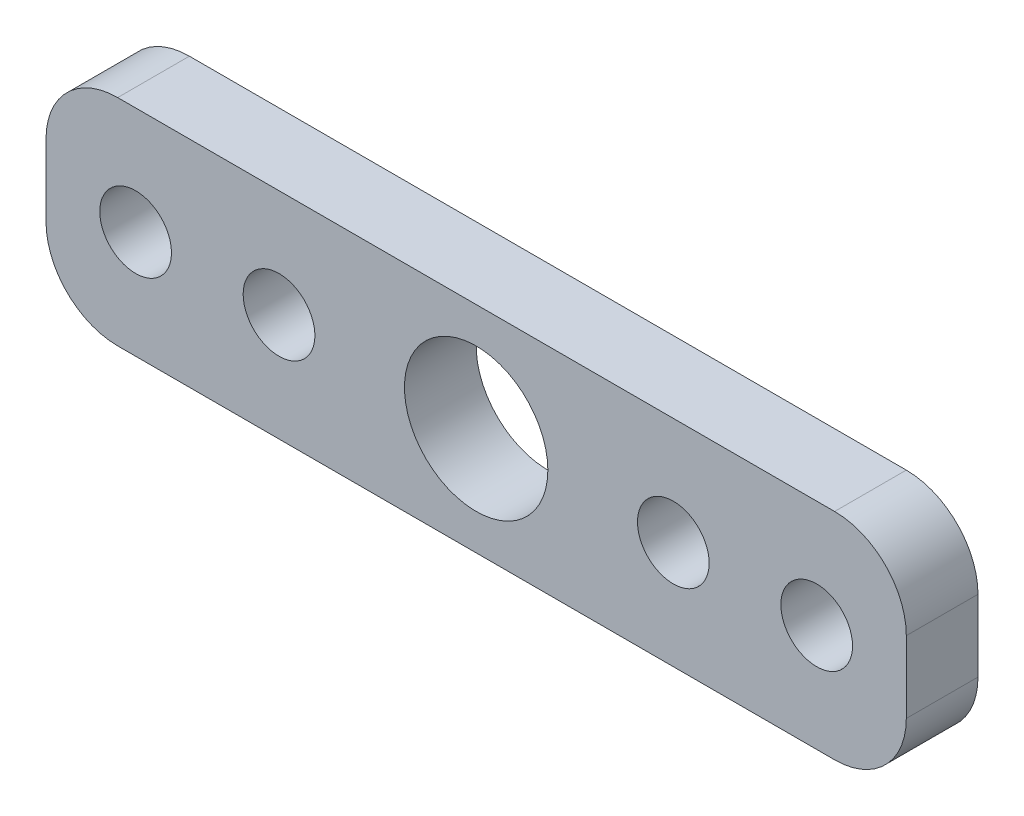
ISO-10303-21;
HEADER;
FILE_DESCRIPTION(('STEP AP214'),'2;1');
FILE_NAME('part.step','',(''),(''),'','','');
FILE_SCHEMA(('AUTOMOTIVE_DESIGN { 1 0 10303 214 1 1 1 1 }'));
ENDSEC;
DATA;
#1=APPLICATION_CONTEXT('core data for automotive mechanical design processes');
#2=APPLICATION_PROTOCOL_DEFINITION('international standard','automotive_design',2000,#1);
#3=PRODUCT_CONTEXT('',#1,'mechanical');
#4=PRODUCT('Part','Part','',(#3));
#5=PRODUCT_RELATED_PRODUCT_CATEGORY('part','',(#4));
#6=PRODUCT_DEFINITION_FORMATION('','',#4);
#7=PRODUCT_DEFINITION_CONTEXT('part definition',#1,'design');
#8=PRODUCT_DEFINITION('design','',#6,#7);
#9=PRODUCT_DEFINITION_SHAPE('','',#8);
#10=(LENGTH_UNIT() NAMED_UNIT(*) SI_UNIT(.MILLI.,.METRE.));
#11=(NAMED_UNIT(*) PLANE_ANGLE_UNIT() SI_UNIT($,.RADIAN.));
#12=(NAMED_UNIT(*) SI_UNIT($,.STERADIAN.) SOLID_ANGLE_UNIT());
#13=UNCERTAINTY_MEASURE_WITH_UNIT(LENGTH_MEASURE(1.E-05),#10,'distance_accuracy_value','');
#14=(GEOMETRIC_REPRESENTATION_CONTEXT(3) GLOBAL_UNCERTAINTY_ASSIGNED_CONTEXT((#13)) GLOBAL_UNIT_ASSIGNED_CONTEXT((#10,
#11,#12)) REPRESENTATION_CONTEXT('',''));
#15=CARTESIAN_POINT('',(0.,0.,0.));
#16=DIRECTION('',(0.,0.,1.));
#17=DIRECTION('',(1.,0.,0.));
#18=AXIS2_PLACEMENT_3D('',#15,#16,#17);
#19=CARTESIAN_POINT('',(15.2499999999977,415.834574892924,2.));
#20=DIRECTION('',(0.,0.,-1.));
#21=DIRECTION('',(-1.,0.,0.));
#22=AXIS2_PLACEMENT_3D('',#19,#20,#21);
#23=PLANE('',#22);
#24=CARTESIAN_POINT('',(15.2499999999977,415.834574892924,2.));
#25=DIRECTION('',(0.,0.,1.));
#26=DIRECTION('',(-1.,0.,0.));
#27=AXIS2_PLACEMENT_3D('',#24,#25,#26);
#28=CIRCLE('',#27,2.);
#29=CARTESIAN_POINT('',(17.2499999999977,415.834574892924,2.));
#30=VERTEX_POINT('',#29);
#31=CARTESIAN_POINT('',(15.2499999999977,417.834574892924,2.));
#32=VERTEX_POINT('',#31);
#33=EDGE_CURVE('E145',#30,#32,#28,.T.);
#34=ORIENTED_EDGE('',*,*,#33,.T.);
#35=DIRECTION('',(-1.,0.,0.));
#36=VECTOR('',#35,1.);
#37=CARTESIAN_POINT('',(-4.75000000000228,417.834574892924,2.));
#38=LINE('',#37,#36);
#39=CARTESIAN_POINT('',(-4.75000000000228,417.834574892924,2.));
#40=VERTEX_POINT('',#39);
#41=EDGE_CURVE('E93',#32,#40,#38,.T.);
#42=ORIENTED_EDGE('',*,*,#41,.T.);
#43=CARTESIAN_POINT('',(-4.75000000000229,415.834574892924,2.));
#44=DIRECTION('',(0.,0.,1.));
#45=DIRECTION('',(1.,0.,0.));
#46=AXIS2_PLACEMENT_3D('',#43,#44,#45);
#47=CIRCLE('',#46,2.);
#48=CARTESIAN_POINT('',(-6.75000000000229,415.834574892924,2.));
#49=VERTEX_POINT('',#48);
#50=EDGE_CURVE('E160',#40,#49,#47,.T.);
#51=ORIENTED_EDGE('',*,*,#50,.T.);
#52=DIRECTION('',(0.,-1.,0.));
#53=VECTOR('',#52,1.);
#54=CARTESIAN_POINT('',(-6.75000000000229,415.834574892924,2.));
#55=LINE('',#54,#53);
#56=CARTESIAN_POINT('',(-6.75000000000229,413.834574892924,2.));
#57=VERTEX_POINT('',#56);
#58=EDGE_CURVE('E173',#49,#57,#55,.T.);
#59=ORIENTED_EDGE('',*,*,#58,.T.);
#60=CARTESIAN_POINT('',(-4.75000000000229,413.834574892924,2.));
#61=DIRECTION('',(0.,0.,1.));
#62=DIRECTION('',(1.,0.,0.));
#63=AXIS2_PLACEMENT_3D('',#60,#61,#62);
#64=CIRCLE('',#63,2.);
#65=CARTESIAN_POINT('',(-4.75000000000228,411.834574892924,2.));
#66=VERTEX_POINT('',#65);
#67=EDGE_CURVE('E112',#57,#66,#64,.T.);
#68=ORIENTED_EDGE('',*,*,#67,.T.);
#69=DIRECTION('',(1.,0.,0.));
#70=VECTOR('',#69,1.);
#71=CARTESIAN_POINT('',(-4.75000000000228,411.834574892924,2.));
#72=LINE('',#71,#70);
#73=CARTESIAN_POINT('',(15.2499999999977,411.834574892924,2.));
#74=VERTEX_POINT('',#73);
#75=EDGE_CURVE('E106',#66,#74,#72,.T.);
#76=ORIENTED_EDGE('',*,*,#75,.T.);
#77=CARTESIAN_POINT('',(15.2499999999977,413.834574892924,2.));
#78=DIRECTION('',(0.,0.,1.));
#79=DIRECTION('',(1.,0.,0.));
#80=AXIS2_PLACEMENT_3D('',#77,#78,#79);
#81=CIRCLE('',#80,2.);
#82=CARTESIAN_POINT('',(17.2499999999977,413.834574892924,2.));
#83=VERTEX_POINT('',#82);
#84=EDGE_CURVE('E110',#74,#83,#81,.T.);
#85=ORIENTED_EDGE('',*,*,#84,.T.);
#86=DIRECTION('',(0.,1.,0.));
#87=VECTOR('',#86,1.);
#88=CARTESIAN_POINT('',(17.2499999999977,415.834574892924,2.));
#89=LINE('',#88,#87);
#90=EDGE_CURVE('E50',#83,#30,#89,.T.);
#91=ORIENTED_EDGE('',*,*,#90,.T.);
#92=EDGE_LOOP('',(#34,#42,#51,#59,#68,#76,#85,#91));
#93=FACE_BOUND('',#92,.T.);
#94=CARTESIAN_POINT('',(5.2499999999977,414.834574892924,2.));
#95=DIRECTION('',(0.,0.,1.));
#96=DIRECTION('',(1.,0.,0.));
#97=AXIS2_PLACEMENT_3D('',#94,#95,#96);
#98=CIRCLE('',#97,2.);
#99=CARTESIAN_POINT('',(7.24999999999771,414.834574892924,2.));
#100=VERTEX_POINT('',#99);
#101=EDGE_CURVE('E134',#100,#100,#98,.T.);
#102=ORIENTED_EDGE('',*,*,#101,.F.);
#103=EDGE_LOOP('',(#102));
#104=FACE_BOUND('',#103,.T.);
#105=CARTESIAN_POINT('',(10.7499999999977,414.834574892924,2.));
#106=DIRECTION('',(0.,0.,1.));
#107=DIRECTION('',(1.,0.,0.));
#108=AXIS2_PLACEMENT_3D('',#105,#106,#107);
#109=CIRCLE('',#108,1.);
#110=CARTESIAN_POINT('',(11.7499999999977,414.834574892924,2.));
#111=VERTEX_POINT('',#110);
#112=EDGE_CURVE('E182',#111,#111,#109,.T.);
#113=ORIENTED_EDGE('',*,*,#112,.F.);
#114=EDGE_LOOP('',(#113));
#115=FACE_BOUND('',#114,.T.);
#116=CARTESIAN_POINT('',(14.7499999999977,414.834574892924,2.));
#117=DIRECTION('',(0.,0.,1.));
#118=DIRECTION('',(1.,0.,0.));
#119=AXIS2_PLACEMENT_3D('',#116,#117,#118);
#120=CIRCLE('',#119,1.);
#121=CARTESIAN_POINT('',(15.7499999999977,414.834574892924,2.));
#122=VERTEX_POINT('',#121);
#123=EDGE_CURVE('E188',#122,#122,#120,.T.);
#124=ORIENTED_EDGE('',*,*,#123,.F.);
#125=EDGE_LOOP('',(#124));
#126=FACE_BOUND('',#125,.T.);
#127=CARTESIAN_POINT('',(-0.250000000002293,414.834574892924,2.));
#128=DIRECTION('',(0.,0.,1.));
#129=DIRECTION('',(-1.,0.,0.));
#130=AXIS2_PLACEMENT_3D('',#127,#128,#129);
#131=CIRCLE('',#130,1.);
#132=CARTESIAN_POINT('',(-1.2500000000023,414.834574892924,2.));
#133=VERTEX_POINT('',#132);
#134=EDGE_CURVE('E194',#133,#133,#131,.T.);
#135=ORIENTED_EDGE('',*,*,#134,.F.);
#136=EDGE_LOOP('',(#135));
#137=FACE_BOUND('',#136,.T.);
#138=CARTESIAN_POINT('',(-4.25000000000229,414.834574892924,2.));
#139=DIRECTION('',(0.,0.,1.));
#140=DIRECTION('',(-1.,0.,0.));
#141=AXIS2_PLACEMENT_3D('',#138,#139,#140);
#142=CIRCLE('',#141,1.00000000000001);
#143=CARTESIAN_POINT('',(-5.2500000000023,414.834574892924,2.));
#144=VERTEX_POINT('',#143);
#145=EDGE_CURVE('E200',#144,#144,#142,.T.);
#146=ORIENTED_EDGE('',*,*,#145,.F.);
#147=EDGE_LOOP('',(#146));
#148=FACE_BOUND('',#147,.T.);
#149=ADVANCED_FACE('F33',(#93,#104,#115,#126,#137,#148),#23,.F.);
#150=CARTESIAN_POINT('',(15.2499999999977,415.834574892924,0.));
#151=DIRECTION('',(0.,0.,-1.));
#152=DIRECTION('',(-1.,0.,0.));
#153=AXIS2_PLACEMENT_3D('',#150,#151,#152);
#154=PLANE('',#153);
#155=CARTESIAN_POINT('',(-0.250000000002293,414.834574892924,0.));
#156=DIRECTION('',(0.,0.,1.));
#157=DIRECTION('',(-1.,0.,0.));
#158=AXIS2_PLACEMENT_3D('',#155,#156,#157);
#159=CIRCLE('',#158,1.);
#160=CARTESIAN_POINT('',(-1.2500000000023,414.834574892924,0.));
#161=VERTEX_POINT('',#160);
#162=EDGE_CURVE('E197',#161,#161,#159,.T.);
#163=ORIENTED_EDGE('',*,*,#162,.T.);
#164=EDGE_LOOP('',(#163));
#165=FACE_BOUND('',#164,.T.);
#166=CARTESIAN_POINT('',(10.7499999999977,414.834574892924,0.));
#167=DIRECTION('',(0.,0.,1.));
#168=DIRECTION('',(1.,0.,0.));
#169=AXIS2_PLACEMENT_3D('',#166,#167,#168);
#170=CIRCLE('',#169,1.);
#171=CARTESIAN_POINT('',(11.7499999999977,414.834574892924,0.));
#172=VERTEX_POINT('',#171);
#173=EDGE_CURVE('E185',#172,#172,#170,.T.);
#174=ORIENTED_EDGE('',*,*,#173,.T.);
#175=EDGE_LOOP('',(#174));
#176=FACE_BOUND('',#175,.T.);
#177=CARTESIAN_POINT('',(15.2499999999977,415.834574892924,0.));
#178=DIRECTION('',(0.,0.,1.));
#179=DIRECTION('',(-1.,0.,0.));
#180=AXIS2_PLACEMENT_3D('',#177,#178,#179);
#181=CIRCLE('',#180,2.);
#182=CARTESIAN_POINT('',(17.2499999999977,415.834574892924,0.));
#183=VERTEX_POINT('',#182);
#184=CARTESIAN_POINT('',(15.2499999999977,417.834574892924,0.));
#185=VERTEX_POINT('',#184);
#186=EDGE_CURVE('E130',#183,#185,#181,.T.);
#187=ORIENTED_EDGE('',*,*,#186,.F.);
#188=DIRECTION('',(0.,1.,0.));
#189=VECTOR('',#188,1.);
#190=CARTESIAN_POINT('',(17.2499999999977,415.834574892924,0.));
#191=LINE('',#190,#189);
#192=CARTESIAN_POINT('',(17.2499999999977,413.834574892924,0.));
#193=VERTEX_POINT('',#192);
#194=EDGE_CURVE('E85',#193,#183,#191,.T.);
#195=ORIENTED_EDGE('',*,*,#194,.F.);
#196=CARTESIAN_POINT('',(15.2499999999977,413.834574892924,0.));
#197=DIRECTION('',(0.,0.,1.));
#198=DIRECTION('',(1.,0.,0.));
#199=AXIS2_PLACEMENT_3D('',#196,#197,#198);
#200=CIRCLE('',#199,2.);
#201=CARTESIAN_POINT('',(15.2499999999977,411.834574892924,0.));
#202=VERTEX_POINT('',#201);
#203=EDGE_CURVE('E79',#202,#193,#200,.T.);
#204=ORIENTED_EDGE('',*,*,#203,.F.);
#205=DIRECTION('',(1.,0.,0.));
#206=VECTOR('',#205,1.);
#207=CARTESIAN_POINT('',(-4.75000000000228,411.834574892924,0.));
#208=LINE('',#207,#206);
#209=CARTESIAN_POINT('',(-4.75000000000228,411.834574892924,0.));
#210=VERTEX_POINT('',#209);
#211=EDGE_CURVE('E120',#210,#202,#208,.T.);
#212=ORIENTED_EDGE('',*,*,#211,.F.);
#213=CARTESIAN_POINT('',(-4.75000000000229,413.834574892924,0.));
#214=DIRECTION('',(0.,0.,1.));
#215=DIRECTION('',(1.,0.,0.));
#216=AXIS2_PLACEMENT_3D('',#213,#214,#215);
#217=CIRCLE('',#216,2.);
#218=CARTESIAN_POINT('',(-6.75000000000229,413.834574892924,0.));
#219=VERTEX_POINT('',#218);
#220=EDGE_CURVE('E140',#219,#210,#217,.T.);
#221=ORIENTED_EDGE('',*,*,#220,.F.);
#222=DIRECTION('',(0.,-1.,0.));
#223=VECTOR('',#222,1.);
#224=CARTESIAN_POINT('',(-6.75000000000229,415.834574892924,0.));
#225=LINE('',#224,#223);
#226=CARTESIAN_POINT('',(-6.75000000000229,415.834574892924,0.));
#227=VERTEX_POINT('',#226);
#228=EDGE_CURVE('E138',#227,#219,#225,.T.);
#229=ORIENTED_EDGE('',*,*,#228,.F.);
#230=CARTESIAN_POINT('',(-4.75000000000229,415.834574892924,0.));
#231=DIRECTION('',(0.,0.,1.));
#232=DIRECTION('',(1.,0.,0.));
#233=AXIS2_PLACEMENT_3D('',#230,#231,#232);
#234=CIRCLE('',#233,2.);
#235=CARTESIAN_POINT('',(-4.75000000000228,417.834574892924,0.));
#236=VERTEX_POINT('',#235);
#237=EDGE_CURVE('E136',#236,#227,#234,.T.);
#238=ORIENTED_EDGE('',*,*,#237,.F.);
#239=DIRECTION('',(-1.,0.,0.));
#240=VECTOR('',#239,1.);
#241=CARTESIAN_POINT('',(-4.75000000000228,417.834574892924,0.));
#242=LINE('',#241,#240);
#243=EDGE_CURVE('E133',#185,#236,#242,.T.);
#244=ORIENTED_EDGE('',*,*,#243,.F.);
#245=EDGE_LOOP('',(#187,#195,#204,#212,#221,#229,#238,#244));
#246=FACE_BOUND('',#245,.T.);
#247=CARTESIAN_POINT('',(5.2499999999977,414.834574892924,0.));
#248=DIRECTION('',(0.,0.,1.));
#249=DIRECTION('',(1.,0.,0.));
#250=AXIS2_PLACEMENT_3D('',#247,#248,#249);
#251=CIRCLE('',#250,2.);
#252=CARTESIAN_POINT('',(7.24999999999771,414.834574892924,0.));
#253=VERTEX_POINT('',#252);
#254=EDGE_CURVE('E179',#253,#253,#251,.T.);
#255=ORIENTED_EDGE('',*,*,#254,.T.);
#256=EDGE_LOOP('',(#255));
#257=FACE_BOUND('',#256,.T.);
#258=CARTESIAN_POINT('',(14.7499999999977,414.834574892924,0.));
#259=DIRECTION('',(0.,0.,1.));
#260=DIRECTION('',(1.,0.,0.));
#261=AXIS2_PLACEMENT_3D('',#258,#259,#260);
#262=CIRCLE('',#261,1.);
#263=CARTESIAN_POINT('',(15.7499999999977,414.834574892924,0.));
#264=VERTEX_POINT('',#263);
#265=EDGE_CURVE('E191',#264,#264,#262,.T.);
#266=ORIENTED_EDGE('',*,*,#265,.T.);
#267=EDGE_LOOP('',(#266));
#268=FACE_BOUND('',#267,.T.);
#269=CARTESIAN_POINT('',(-4.25000000000229,414.834574892924,0.));
#270=DIRECTION('',(0.,0.,1.));
#271=DIRECTION('',(-1.,0.,0.));
#272=AXIS2_PLACEMENT_3D('',#269,#270,#271);
#273=CIRCLE('',#272,1.00000000000001);
#274=CARTESIAN_POINT('',(-5.2500000000023,414.834574892924,0.));
#275=VERTEX_POINT('',#274);
#276=EDGE_CURVE('E203',#275,#275,#273,.T.);
#277=ORIENTED_EDGE('',*,*,#276,.T.);
#278=EDGE_LOOP('',(#277));
#279=FACE_BOUND('',#278,.T.);
#280=ADVANCED_FACE('F164',(#165,#176,#246,#257,#268,#279),#154,.T.);
#281=CARTESIAN_POINT('',(15.2499999999977,415.834574892924,2.));
#282=DIRECTION('',(0.,0.,-1.));
#283=DIRECTION('',(-1.,0.,0.));
#284=AXIS2_PLACEMENT_3D('',#281,#282,#283);
#285=CYLINDRICAL_SURFACE('',#284,2.);
#286=ORIENTED_EDGE('',*,*,#186,.T.);
#287=DIRECTION('',(0.,0.,-1.));
#288=VECTOR('',#287,1.);
#289=CARTESIAN_POINT('',(15.2499999999977,417.834574892924,2.));
#290=LINE('',#289,#288);
#291=EDGE_CURVE('E11',#32,#185,#290,.T.);
#292=ORIENTED_EDGE('',*,*,#291,.F.);
#293=ORIENTED_EDGE('',*,*,#33,.F.);
#294=DIRECTION('',(0.,0.,-1.));
#295=VECTOR('',#294,1.);
#296=CARTESIAN_POINT('',(17.2499999999977,415.834574892924,2.));
#297=LINE('',#296,#295);
#298=EDGE_CURVE('E126',#30,#183,#297,.T.);
#299=ORIENTED_EDGE('',*,*,#298,.T.);
#300=EDGE_LOOP('',(#286,#292,#293,#299));
#301=FACE_BOUND('',#300,.T.);
#302=ADVANCED_FACE('F35',(#301),#285,.T.);
#303=CARTESIAN_POINT('',(-4.75000000000228,417.834574892924,2.));
#304=DIRECTION('',(0.,-1.,0.));
#305=DIRECTION('',(0.,0.,-1.));
#306=AXIS2_PLACEMENT_3D('',#303,#304,#305);
#307=PLANE('',#306);
#308=ORIENTED_EDGE('',*,*,#243,.T.);
#309=DIRECTION('',(0.,0.,-1.));
#310=VECTOR('',#309,1.);
#311=CARTESIAN_POINT('',(-4.75000000000228,417.834574892924,2.));
#312=LINE('',#311,#310);
#313=EDGE_CURVE('E42',#40,#236,#312,.T.);
#314=ORIENTED_EDGE('',*,*,#313,.F.);
#315=ORIENTED_EDGE('',*,*,#41,.F.);
#316=ORIENTED_EDGE('',*,*,#291,.T.);
#317=EDGE_LOOP('',(#308,#314,#315,#316));
#318=FACE_BOUND('',#317,.T.);
#319=ADVANCED_FACE('F235',(#318),#307,.F.);
#320=CARTESIAN_POINT('',(-4.75000000000229,415.834574892924,2.));
#321=DIRECTION('',(0.,0.,-1.));
#322=DIRECTION('',(-1.,0.,0.));
#323=AXIS2_PLACEMENT_3D('',#320,#321,#322);
#324=CYLINDRICAL_SURFACE('',#323,2.);
#325=ORIENTED_EDGE('',*,*,#237,.T.);
#326=DIRECTION('',(0.,0.,-1.));
#327=VECTOR('',#326,1.);
#328=CARTESIAN_POINT('',(-6.75000000000229,415.834574892924,2.));
#329=LINE('',#328,#327);
#330=EDGE_CURVE('E152',#49,#227,#329,.T.);
#331=ORIENTED_EDGE('',*,*,#330,.F.);
#332=ORIENTED_EDGE('',*,*,#50,.F.);
#333=ORIENTED_EDGE('',*,*,#313,.T.);
#334=EDGE_LOOP('',(#325,#331,#332,#333));
#335=FACE_BOUND('',#334,.T.);
#336=ADVANCED_FACE('F158',(#335),#324,.T.);
#337=CARTESIAN_POINT('',(-6.75000000000229,415.834574892924,2.));
#338=DIRECTION('',(1.,0.,0.));
#339=DIRECTION('',(0.,0.,-1.));
#340=AXIS2_PLACEMENT_3D('',#337,#338,#339);
#341=PLANE('',#340);
#342=ORIENTED_EDGE('',*,*,#228,.T.);
#343=DIRECTION('',(0.,0.,-1.));
#344=VECTOR('',#343,1.);
#345=CARTESIAN_POINT('',(-6.75000000000229,413.834574892924,2.));
#346=LINE('',#345,#344);
#347=EDGE_CURVE('E149',#57,#219,#346,.T.);
#348=ORIENTED_EDGE('',*,*,#347,.F.);
#349=ORIENTED_EDGE('',*,*,#58,.F.);
#350=ORIENTED_EDGE('',*,*,#330,.T.);
#351=EDGE_LOOP('',(#342,#348,#349,#350));
#352=FACE_BOUND('',#351,.T.);
#353=ADVANCED_FACE('F169',(#352),#341,.F.);
#354=CARTESIAN_POINT('',(-4.75000000000229,413.834574892924,2.));
#355=DIRECTION('',(0.,0.,-1.));
#356=DIRECTION('',(-1.,0.,0.));
#357=AXIS2_PLACEMENT_3D('',#354,#355,#356);
#358=CYLINDRICAL_SURFACE('',#357,2.);
#359=ORIENTED_EDGE('',*,*,#220,.T.);
#360=DIRECTION('',(0.,0.,-1.));
#361=VECTOR('',#360,1.);
#362=CARTESIAN_POINT('',(-4.75000000000228,411.834574892924,2.));
#363=LINE('',#362,#361);
#364=EDGE_CURVE('E121',#66,#210,#363,.T.);
#365=ORIENTED_EDGE('',*,*,#364,.F.);
#366=ORIENTED_EDGE('',*,*,#67,.F.);
#367=ORIENTED_EDGE('',*,*,#347,.T.);
#368=EDGE_LOOP('',(#359,#365,#366,#367));
#369=FACE_BOUND('',#368,.T.);
#370=ADVANCED_FACE('F172',(#369),#358,.T.);
#371=CARTESIAN_POINT('',(-4.75000000000228,411.834574892924,2.));
#372=DIRECTION('',(0.,1.,0.));
#373=DIRECTION('',(0.,0.,1.));
#374=AXIS2_PLACEMENT_3D('',#371,#372,#373);
#375=PLANE('',#374);
#376=ORIENTED_EDGE('',*,*,#211,.T.);
#377=DIRECTION('',(0.,0.,-1.));
#378=VECTOR('',#377,1.);
#379=CARTESIAN_POINT('',(15.2499999999977,411.834574892924,2.));
#380=LINE('',#379,#378);
#381=EDGE_CURVE('E117',#74,#202,#380,.T.);
#382=ORIENTED_EDGE('',*,*,#381,.F.);
#383=ORIENTED_EDGE('',*,*,#75,.F.);
#384=ORIENTED_EDGE('',*,*,#364,.T.);
#385=EDGE_LOOP('',(#376,#382,#383,#384));
#386=FACE_BOUND('',#385,.T.);
#387=ADVANCED_FACE('F118',(#386),#375,.F.);
#388=CARTESIAN_POINT('',(15.2499999999977,413.834574892924,2.));
#389=DIRECTION('',(0.,0.,-1.));
#390=DIRECTION('',(-1.,0.,0.));
#391=AXIS2_PLACEMENT_3D('',#388,#389,#390);
#392=CYLINDRICAL_SURFACE('',#391,2.);
#393=ORIENTED_EDGE('',*,*,#203,.T.);
#394=DIRECTION('',(0.,0.,-1.));
#395=VECTOR('',#394,1.);
#396=CARTESIAN_POINT('',(17.2499999999977,413.834574892924,2.));
#397=LINE('',#396,#395);
#398=EDGE_CURVE('E122',#83,#193,#397,.T.);
#399=ORIENTED_EDGE('',*,*,#398,.F.);
#400=ORIENTED_EDGE('',*,*,#84,.F.);
#401=ORIENTED_EDGE('',*,*,#381,.T.);
#402=EDGE_LOOP('',(#393,#399,#400,#401));
#403=FACE_BOUND('',#402,.T.);
#404=ADVANCED_FACE('F124',(#403),#392,.T.);
#405=CARTESIAN_POINT('',(17.2499999999977,415.834574892924,2.));
#406=DIRECTION('',(-1.,0.,0.));
#407=DIRECTION('',(0.,0.,1.));
#408=AXIS2_PLACEMENT_3D('',#405,#406,#407);
#409=PLANE('',#408);
#410=ORIENTED_EDGE('',*,*,#194,.T.);
#411=ORIENTED_EDGE('',*,*,#298,.F.);
#412=ORIENTED_EDGE('',*,*,#90,.F.);
#413=ORIENTED_EDGE('',*,*,#398,.T.);
#414=EDGE_LOOP('',(#410,#411,#412,#413));
#415=FACE_BOUND('',#414,.T.);
#416=ADVANCED_FACE('F223',(#415),#409,.F.);
#417=CARTESIAN_POINT('',(5.2499999999977,414.834574892924,2.));
#418=DIRECTION('',(0.,0.,-1.));
#419=DIRECTION('',(-1.,0.,0.));
#420=AXIS2_PLACEMENT_3D('',#417,#418,#419);
#421=CYLINDRICAL_SURFACE('',#420,2.);
#422=ORIENTED_EDGE('',*,*,#101,.T.);
#423=EDGE_LOOP('',(#422));
#424=FACE_BOUND('',#423,.T.);
#425=ORIENTED_EDGE('',*,*,#254,.F.);
#426=EDGE_LOOP('',(#425));
#427=FACE_BOUND('',#426,.T.);
#428=ADVANCED_FACE('F220',(#424,#427),#421,.F.);
#429=CARTESIAN_POINT('',(10.7499999999977,414.834574892924,2.));
#430=DIRECTION('',(0.,0.,-1.));
#431=DIRECTION('',(-1.,0.,0.));
#432=AXIS2_PLACEMENT_3D('',#429,#430,#431);
#433=CYLINDRICAL_SURFACE('',#432,1.);
#434=ORIENTED_EDGE('',*,*,#112,.T.);
#435=EDGE_LOOP('',(#434));
#436=FACE_BOUND('',#435,.T.);
#437=ORIENTED_EDGE('',*,*,#173,.F.);
#438=EDGE_LOOP('',(#437));
#439=FACE_BOUND('',#438,.T.);
#440=ADVANCED_FACE('F299',(#436,#439),#433,.F.);
#441=CARTESIAN_POINT('',(14.7499999999977,414.834574892924,2.));
#442=DIRECTION('',(0.,0.,-1.));
#443=DIRECTION('',(-1.,0.,0.));
#444=AXIS2_PLACEMENT_3D('',#441,#442,#443);
#445=CYLINDRICAL_SURFACE('',#444,1.);
#446=ORIENTED_EDGE('',*,*,#123,.T.);
#447=EDGE_LOOP('',(#446));
#448=FACE_BOUND('',#447,.T.);
#449=ORIENTED_EDGE('',*,*,#265,.F.);
#450=EDGE_LOOP('',(#449));
#451=FACE_BOUND('',#450,.T.);
#452=ADVANCED_FACE('F307',(#448,#451),#445,.F.);
#453=CARTESIAN_POINT('',(-0.250000000002293,414.834574892924,2.));
#454=DIRECTION('',(0.,0.,-1.));
#455=DIRECTION('',(-1.,0.,0.));
#456=AXIS2_PLACEMENT_3D('',#453,#454,#455);
#457=CYLINDRICAL_SURFACE('',#456,1.);
#458=ORIENTED_EDGE('',*,*,#134,.T.);
#459=EDGE_LOOP('',(#458));
#460=FACE_BOUND('',#459,.T.);
#461=ORIENTED_EDGE('',*,*,#162,.F.);
#462=EDGE_LOOP('',(#461));
#463=FACE_BOUND('',#462,.T.);
#464=ADVANCED_FACE('F315',(#460,#463),#457,.F.);
#465=CARTESIAN_POINT('',(-4.25000000000229,414.834574892924,2.));
#466=DIRECTION('',(0.,0.,-1.));
#467=DIRECTION('',(-1.,0.,0.));
#468=AXIS2_PLACEMENT_3D('',#465,#466,#467);
#469=CYLINDRICAL_SURFACE('',#468,1.00000000000001);
#470=ORIENTED_EDGE('',*,*,#145,.T.);
#471=EDGE_LOOP('',(#470));
#472=FACE_BOUND('',#471,.T.);
#473=ORIENTED_EDGE('',*,*,#276,.F.);
#474=EDGE_LOOP('',(#473));
#475=FACE_BOUND('',#474,.T.);
#476=ADVANCED_FACE('F209',(#472,#475),#469,.F.);
#477=CLOSED_SHELL('',(#149,#280,#302,#319,#336,#353,#370,#387,#404,#416,#428,#440,#452,#464,#476));
#478=MANIFOLD_SOLID_BREP('B2',#477);
#479=ADVANCED_BREP_SHAPE_REPRESENTATION('',(#18,#478),#14);
#480=SHAPE_DEFINITION_REPRESENTATION(#9,#479);
ENDSEC;
END-ISO-10303-21;
